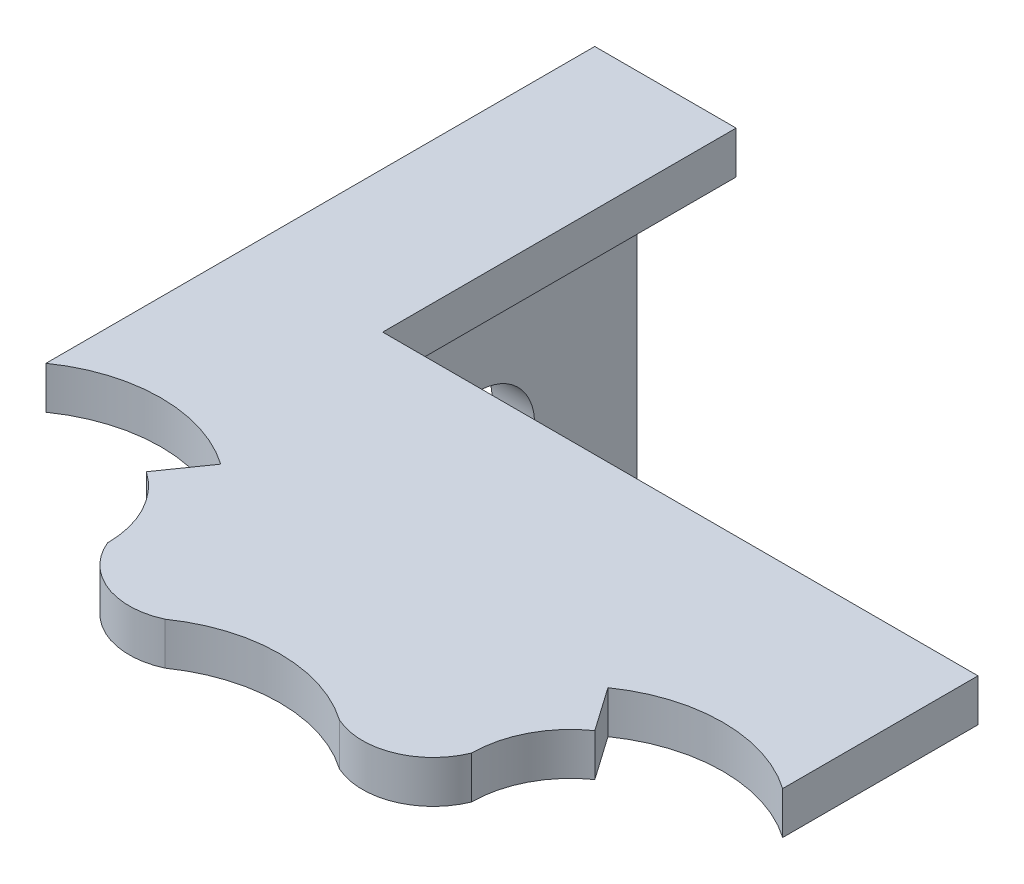
ISO-10303-21;
HEADER;
FILE_DESCRIPTION(('STEP AP214'),'2;1');
FILE_NAME('part.step','',(''),(''),'','','');
FILE_SCHEMA(('AUTOMOTIVE_DESIGN { 1 0 10303 214 1 1 1 1 }'));
ENDSEC;
DATA;
#1=APPLICATION_CONTEXT('core data for automotive mechanical design processes');
#2=APPLICATION_PROTOCOL_DEFINITION('international standard','automotive_design',2000,#1);
#3=PRODUCT_CONTEXT('',#1,'mechanical');
#4=PRODUCT('Part','Part','',(#3));
#5=PRODUCT_RELATED_PRODUCT_CATEGORY('part','',(#4));
#6=PRODUCT_DEFINITION_FORMATION('','',#4);
#7=PRODUCT_DEFINITION_CONTEXT('part definition',#1,'design');
#8=PRODUCT_DEFINITION('design','',#6,#7);
#9=PRODUCT_DEFINITION_SHAPE('','',#8);
#10=(LENGTH_UNIT() NAMED_UNIT(*) SI_UNIT(.MILLI.,.METRE.));
#11=(NAMED_UNIT(*) PLANE_ANGLE_UNIT() SI_UNIT($,.RADIAN.));
#12=(NAMED_UNIT(*) SI_UNIT($,.STERADIAN.) SOLID_ANGLE_UNIT());
#13=UNCERTAINTY_MEASURE_WITH_UNIT(LENGTH_MEASURE(1.E-05),#10,'distance_accuracy_value','');
#14=(GEOMETRIC_REPRESENTATION_CONTEXT(3) GLOBAL_UNCERTAINTY_ASSIGNED_CONTEXT((#13)) GLOBAL_UNIT_ASSIGNED_CONTEXT((#10,
#11,#12)) REPRESENTATION_CONTEXT('',''));
#15=CARTESIAN_POINT('',(0.,0.,0.));
#16=DIRECTION('',(0.,0.,1.));
#17=DIRECTION('',(1.,0.,0.));
#18=AXIS2_PLACEMENT_3D('',#15,#16,#17);
#19=CARTESIAN_POINT('',(-19.8752830168529,3.,-11.4749999999999));
#20=DIRECTION('',(0.,-1.,0.));
#21=DIRECTION('',(0.,0.,-1.));
#22=AXIS2_PLACEMENT_3D('',#19,#20,#21);
#23=CYLINDRICAL_SURFACE('',#22,10.775);
#24=CARTESIAN_POINT('',(-19.8752830168529,0.,-11.4749999999999));
#25=DIRECTION('',(0.,-1.,0.));
#26=DIRECTION('',(0.,0.,-1.));
#27=AXIS2_PLACEMENT_3D('',#24,#25,#26);
#28=CIRCLE('',#27,10.775);
#29=CARTESIAN_POINT('',(-26.0555691185354,0.,-20.3013632772138));
#30=VERTEX_POINT('',#29);
#31=CARTESIAN_POINT('',(-13.6949969151704,0.,-20.3013632772138));
#32=VERTEX_POINT('',#31);
#33=EDGE_CURVE('E180',#30,#32,#28,.T.);
#34=ORIENTED_EDGE('',*,*,#33,.T.);
#35=DIRECTION('',(0.,-1.,0.));
#36=VECTOR('',#35,1.);
#37=CARTESIAN_POINT('',(-13.6949969151704,3.,-20.3013632772138));
#38=LINE('',#37,#36);
#39=CARTESIAN_POINT('',(-13.6949969151704,3.,-20.3013632772138));
#40=VERTEX_POINT('',#39);
#41=EDGE_CURVE('E11',#40,#32,#38,.T.);
#42=ORIENTED_EDGE('',*,*,#41,.F.);
#43=CARTESIAN_POINT('',(-19.8752830168529,3.,-11.4749999999999));
#44=DIRECTION('',(0.,-1.,0.));
#45=DIRECTION('',(0.,0.,-1.));
#46=AXIS2_PLACEMENT_3D('',#43,#44,#45);
#47=CIRCLE('',#46,10.775);
#48=CARTESIAN_POINT('',(-26.0555691185354,3.,-20.3013632772138));
#49=VERTEX_POINT('',#48);
#50=EDGE_CURVE('E189',#49,#40,#47,.T.);
#51=ORIENTED_EDGE('',*,*,#50,.F.);
#52=DIRECTION('',(0.,-1.,0.));
#53=VECTOR('',#52,1.);
#54=CARTESIAN_POINT('',(-26.0555691185354,3.,-20.3013632772138));
#55=LINE('',#54,#53);
#56=EDGE_CURVE('E217',#49,#30,#55,.T.);
#57=ORIENTED_EDGE('',*,*,#56,.T.);
#58=EDGE_LOOP('',(#34,#42,#51,#57));
#59=FACE_BOUND('',#58,.T.);
#60=ADVANCED_FACE('F38',(#59),#23,.F.);
#61=CARTESIAN_POINT('',(-15.8602479623956,3.,-17.2090643100228));
#62=DIRECTION('',(0.819152044288993,0.,0.573576436351044));
#63=DIRECTION('',(0.573576436351044,0.,-0.819152044288993));
#64=AXIS2_PLACEMENT_3D('',#61,#62,#63);
#65=PLANE('',#64);
#66=DIRECTION('',(-0.573576436351044,0.,0.819152044288993));
#67=VECTOR('',#66,1.);
#68=CARTESIAN_POINT('',(-15.8602479623956,0.,-17.2090643100228));
#69=LINE('',#68,#67);
#70=CARTESIAN_POINT('',(-15.8602479623956,0.,-17.2090643100228));
#71=VERTEX_POINT('',#70);
#72=EDGE_CURVE('E183',#32,#71,#69,.T.);
#73=ORIENTED_EDGE('',*,*,#72,.T.);
#74=DIRECTION('',(0.,-1.,0.));
#75=VECTOR('',#74,1.);
#76=CARTESIAN_POINT('',(-15.8602479623956,3.,-17.2090643100228));
#77=LINE('',#76,#75);
#78=CARTESIAN_POINT('',(-15.8602479623956,3.,-17.2090643100228));
#79=VERTEX_POINT('',#78);
#80=EDGE_CURVE('E45',#79,#71,#77,.T.);
#81=ORIENTED_EDGE('',*,*,#80,.F.);
#82=DIRECTION('',(-0.573576436351044,0.,0.819152044288993));
#83=VECTOR('',#82,1.);
#84=CARTESIAN_POINT('',(-15.8602479623956,3.,-17.2090643100228));
#85=LINE('',#84,#83);
#86=EDGE_CURVE('E192',#40,#79,#85,.T.);
#87=ORIENTED_EDGE('',*,*,#86,.F.);
#88=ORIENTED_EDGE('',*,*,#41,.T.);
#89=EDGE_LOOP('',(#73,#81,#87,#88));
#90=FACE_BOUND('',#89,.T.);
#91=ADVANCED_FACE('F300',(#90),#65,.F.);
#92=CARTESIAN_POINT('',(-19.875283016853,3.,-11.4749999999998));
#93=DIRECTION('',(0.,-1.,0.));
#94=DIRECTION('',(0.,0.,-1.));
#95=AXIS2_PLACEMENT_3D('',#92,#93,#94);
#96=CYLINDRICAL_SURFACE('',#95,7.00000000000008);
#97=CARTESIAN_POINT('',(-19.875283016853,0.,-11.4749999999998));
#98=DIRECTION('',(0.,-1.,0.));
#99=DIRECTION('',(0.,0.,-1.));
#100=AXIS2_PLACEMENT_3D('',#97,#98,#99);
#101=CIRCLE('',#100,7.00000000000008);
#102=CARTESIAN_POINT('',(-12.8752830168529,0.,-11.4749999999999));
#103=VERTEX_POINT('',#102);
#104=EDGE_CURVE('E220',#71,#103,#101,.T.);
#105=ORIENTED_EDGE('',*,*,#104,.T.);
#106=DIRECTION('',(0.,-1.,0.));
#107=VECTOR('',#106,1.);
#108=CARTESIAN_POINT('',(-12.8752830168529,3.,-11.4749999999999));
#109=LINE('',#108,#107);
#110=CARTESIAN_POINT('',(-12.8752830168529,3.,-11.4749999999999));
#111=VERTEX_POINT('',#110);
#112=EDGE_CURVE('E272',#111,#103,#109,.T.);
#113=ORIENTED_EDGE('',*,*,#112,.F.);
#114=CARTESIAN_POINT('',(-19.875283016853,3.,-11.4749999999998));
#115=DIRECTION('',(0.,-1.,0.));
#116=DIRECTION('',(0.,0.,-1.));
#117=AXIS2_PLACEMENT_3D('',#114,#115,#116);
#118=CIRCLE('',#117,7.00000000000008);
#119=EDGE_CURVE('E194',#79,#111,#118,.T.);
#120=ORIENTED_EDGE('',*,*,#119,.F.);
#121=ORIENTED_EDGE('',*,*,#80,.T.);
#122=EDGE_LOOP('',(#105,#113,#120,#121));
#123=FACE_BOUND('',#122,.T.);
#124=ADVANCED_FACE('F279',(#123),#96,.F.);
#125=CARTESIAN_POINT('',(-8.25129203559566,3.,-13.3772900423571));
#126=DIRECTION('',(0.,-1.,0.));
#127=DIRECTION('',(0.,0.,-1.));
#128=AXIS2_PLACEMENT_3D('',#125,#126,#127);
#129=CYLINDRICAL_SURFACE('',#128,5.);
#130=CARTESIAN_POINT('',(-8.25129203559566,0.,-13.3772900423571));
#131=DIRECTION('',(0.,1.,0.));
#132=DIRECTION('',(0.,0.,1.));
#133=AXIS2_PLACEMENT_3D('',#130,#131,#132);
#134=CIRCLE('',#133,5.);
#135=CARTESIAN_POINT('',(-6.18028610168251,0.,-8.82636327721389));
#136=VERTEX_POINT('',#135);
#137=EDGE_CURVE('E222',#103,#136,#134,.T.);
#138=ORIENTED_EDGE('',*,*,#137,.T.);
#139=DIRECTION('',(0.,-1.,0.));
#140=VECTOR('',#139,1.);
#141=CARTESIAN_POINT('',(-6.18028610168251,3.,-8.82636327721389));
#142=LINE('',#141,#140);
#143=CARTESIAN_POINT('',(-6.18028610168251,3.,-8.82636327721389));
#144=VERTEX_POINT('',#143);
#145=EDGE_CURVE('E269',#144,#136,#142,.T.);
#146=ORIENTED_EDGE('',*,*,#145,.F.);
#147=CARTESIAN_POINT('',(-8.25129203559566,3.,-13.3772900423571));
#148=DIRECTION('',(0.,1.,0.));
#149=DIRECTION('',(0.,0.,1.));
#150=AXIS2_PLACEMENT_3D('',#147,#148,#149);
#151=CIRCLE('',#150,5.);
#152=EDGE_CURVE('E196',#111,#144,#151,.T.);
#153=ORIENTED_EDGE('',*,*,#152,.F.);
#154=ORIENTED_EDGE('',*,*,#112,.T.);
#155=EDGE_LOOP('',(#138,#146,#153,#154));
#156=FACE_BOUND('',#155,.T.);
#157=ADVANCED_FACE('F288',(#156),#129,.T.);
#158=CARTESIAN_POINT('',(0.,3.,0.));
#159=DIRECTION('',(0.,-1.,0.));
#160=DIRECTION('',(0.,0.,-1.));
#161=AXIS2_PLACEMENT_3D('',#158,#159,#160);
#162=CYLINDRICAL_SURFACE('',#161,10.775);
#163=CARTESIAN_POINT('',(0.,0.,0.));
#164=DIRECTION('',(0.,-1.,0.));
#165=DIRECTION('',(0.,0.,-1.));
#166=AXIS2_PLACEMENT_3D('',#163,#164,#165);
#167=CIRCLE('',#166,10.775);
#168=CARTESIAN_POINT('',(6.18028610168249,0.,-8.8263632772139));
#169=VERTEX_POINT('',#168);
#170=EDGE_CURVE('E224',#136,#169,#167,.T.);
#171=ORIENTED_EDGE('',*,*,#170,.T.);
#172=DIRECTION('',(0.,-1.,0.));
#173=VECTOR('',#172,1.);
#174=CARTESIAN_POINT('',(6.18028610168249,3.,-8.8263632772139));
#175=LINE('',#174,#173);
#176=CARTESIAN_POINT('',(6.18028610168249,3.,-8.8263632772139));
#177=VERTEX_POINT('',#176);
#178=EDGE_CURVE('E266',#177,#169,#175,.T.);
#179=ORIENTED_EDGE('',*,*,#178,.F.);
#180=CARTESIAN_POINT('',(0.,3.,0.));
#181=DIRECTION('',(0.,-1.,0.));
#182=DIRECTION('',(0.,0.,-1.));
#183=AXIS2_PLACEMENT_3D('',#180,#181,#182);
#184=CIRCLE('',#183,10.775);
#185=EDGE_CURVE('E198',#144,#177,#184,.T.);
#186=ORIENTED_EDGE('',*,*,#185,.F.);
#187=ORIENTED_EDGE('',*,*,#145,.T.);
#188=EDGE_LOOP('',(#171,#179,#186,#187));
#189=FACE_BOUND('',#188,.T.);
#190=ADVANCED_FACE('F292',(#189),#162,.F.);
#191=CARTESIAN_POINT('',(8.25129203559566,3.,-13.3772900423571));
#192=DIRECTION('',(0.,-1.,0.));
#193=DIRECTION('',(0.,0.,-1.));
#194=AXIS2_PLACEMENT_3D('',#191,#192,#193);
#195=CYLINDRICAL_SURFACE('',#194,5.00000000000001);
#196=CARTESIAN_POINT('',(8.25129203559566,0.,-13.3772900423571));
#197=DIRECTION('',(0.,1.,0.));
#198=DIRECTION('',(0.,0.,1.));
#199=AXIS2_PLACEMENT_3D('',#196,#197,#198);
#200=CIRCLE('',#199,5.00000000000001);
#201=CARTESIAN_POINT('',(12.8752830168529,0.,-11.4749999999998));
#202=VERTEX_POINT('',#201);
#203=EDGE_CURVE('E226',#169,#202,#200,.T.);
#204=ORIENTED_EDGE('',*,*,#203,.T.);
#205=DIRECTION('',(0.,-1.,0.));
#206=VECTOR('',#205,1.);
#207=CARTESIAN_POINT('',(12.8752830168529,3.,-11.4749999999998));
#208=LINE('',#207,#206);
#209=CARTESIAN_POINT('',(12.8752830168529,3.,-11.4749999999998));
#210=VERTEX_POINT('',#209);
#211=EDGE_CURVE('E263',#210,#202,#208,.T.);
#212=ORIENTED_EDGE('',*,*,#211,.F.);
#213=CARTESIAN_POINT('',(8.25129203559566,3.,-13.3772900423571));
#214=DIRECTION('',(0.,1.,0.));
#215=DIRECTION('',(0.,0.,1.));
#216=AXIS2_PLACEMENT_3D('',#213,#214,#215);
#217=CIRCLE('',#216,5.00000000000001);
#218=EDGE_CURVE('E200',#177,#210,#217,.T.);
#219=ORIENTED_EDGE('',*,*,#218,.F.);
#220=ORIENTED_EDGE('',*,*,#178,.T.);
#221=EDGE_LOOP('',(#204,#212,#219,#220));
#222=FACE_BOUND('',#221,.T.);
#223=ADVANCED_FACE('F348',(#222),#195,.T.);
#224=CARTESIAN_POINT('',(19.875283016853,3.,-11.4749999999998));
#225=DIRECTION('',(0.,-1.,0.));
#226=DIRECTION('',(0.,0.,-1.));
#227=AXIS2_PLACEMENT_3D('',#224,#225,#226);
#228=CYLINDRICAL_SURFACE('',#227,7.0000000000001);
#229=CARTESIAN_POINT('',(19.875283016853,0.,-11.4749999999998));
#230=DIRECTION('',(0.,-1.,0.));
#231=DIRECTION('',(0.,0.,-1.));
#232=AXIS2_PLACEMENT_3D('',#229,#230,#231);
#233=CIRCLE('',#232,7.0000000000001);
#234=CARTESIAN_POINT('',(15.8602479623956,0.,-17.2090643100228));
#235=VERTEX_POINT('',#234);
#236=EDGE_CURVE('E228',#202,#235,#233,.T.);
#237=ORIENTED_EDGE('',*,*,#236,.T.);
#238=DIRECTION('',(0.,-1.,0.));
#239=VECTOR('',#238,1.);
#240=CARTESIAN_POINT('',(15.8602479623956,3.,-17.2090643100228));
#241=LINE('',#240,#239);
#242=CARTESIAN_POINT('',(15.8602479623956,3.,-17.2090643100228));
#243=VERTEX_POINT('',#242);
#244=EDGE_CURVE('E260',#243,#235,#241,.T.);
#245=ORIENTED_EDGE('',*,*,#244,.F.);
#246=CARTESIAN_POINT('',(19.875283016853,3.,-11.4749999999998));
#247=DIRECTION('',(0.,-1.,0.));
#248=DIRECTION('',(0.,0.,-1.));
#249=AXIS2_PLACEMENT_3D('',#246,#247,#248);
#250=CIRCLE('',#249,7.0000000000001);
#251=EDGE_CURVE('E202',#210,#243,#250,.T.);
#252=ORIENTED_EDGE('',*,*,#251,.F.);
#253=ORIENTED_EDGE('',*,*,#211,.T.);
#254=EDGE_LOOP('',(#237,#245,#252,#253));
#255=FACE_BOUND('',#254,.T.);
#256=ADVANCED_FACE('F351',(#255),#228,.F.);
#257=CARTESIAN_POINT('',(15.8602479623956,3.,-17.2090643100228));
#258=DIRECTION('',(-0.819152044288992,0.,0.573576436351045));
#259=DIRECTION('',(0.573576436351045,0.,0.819152044288992));
#260=AXIS2_PLACEMENT_3D('',#257,#258,#259);
#261=PLANE('',#260);
#262=DIRECTION('',(-0.573576436351045,0.,-0.819152044288992));
#263=VECTOR('',#262,1.);
#264=CARTESIAN_POINT('',(15.8602479623956,0.,-17.2090643100228));
#265=LINE('',#264,#263);
#266=CARTESIAN_POINT('',(13.6949969151704,0.,-20.3013632772138));
#267=VERTEX_POINT('',#266);
#268=EDGE_CURVE('E230',#235,#267,#265,.T.);
#269=ORIENTED_EDGE('',*,*,#268,.T.);
#270=DIRECTION('',(0.,-1.,0.));
#271=VECTOR('',#270,1.);
#272=CARTESIAN_POINT('',(13.6949969151704,3.,-20.3013632772138));
#273=LINE('',#272,#271);
#274=CARTESIAN_POINT('',(13.6949969151704,3.,-20.3013632772138));
#275=VERTEX_POINT('',#274);
#276=EDGE_CURVE('E257',#275,#267,#273,.T.);
#277=ORIENTED_EDGE('',*,*,#276,.F.);
#278=DIRECTION('',(-0.573576436351045,0.,-0.819152044288992));
#279=VECTOR('',#278,1.);
#280=CARTESIAN_POINT('',(15.8602479623956,3.,-17.2090643100228));
#281=LINE('',#280,#279);
#282=EDGE_CURVE('E204',#243,#275,#281,.T.);
#283=ORIENTED_EDGE('',*,*,#282,.F.);
#284=ORIENTED_EDGE('',*,*,#244,.T.);
#285=EDGE_LOOP('',(#269,#277,#283,#284));
#286=FACE_BOUND('',#285,.T.);
#287=ADVANCED_FACE('F355',(#286),#261,.F.);
#288=CARTESIAN_POINT('',(19.8752830168529,3.,-11.4749999999998));
#289=DIRECTION('',(0.,-1.,0.));
#290=DIRECTION('',(0.,0.,-1.));
#291=AXIS2_PLACEMENT_3D('',#288,#289,#290);
#292=CYLINDRICAL_SURFACE('',#291,10.775);
#293=CARTESIAN_POINT('',(19.8752830168529,0.,-11.4749999999998));
#294=DIRECTION('',(0.,-1.,0.));
#295=DIRECTION('',(0.,0.,-1.));
#296=AXIS2_PLACEMENT_3D('',#293,#294,#295);
#297=CIRCLE('',#296,10.775);
#298=CARTESIAN_POINT('',(26.0555691185354,0.,-20.3013632772138));
#299=VERTEX_POINT('',#298);
#300=EDGE_CURVE('E232',#267,#299,#297,.T.);
#301=ORIENTED_EDGE('',*,*,#300,.T.);
#302=DIRECTION('',(0.,-1.,0.));
#303=VECTOR('',#302,1.);
#304=CARTESIAN_POINT('',(26.0555691185354,3.,-20.3013632772138));
#305=LINE('',#304,#303);
#306=CARTESIAN_POINT('',(26.0555691185354,3.,-20.3013632772138));
#307=VERTEX_POINT('',#306);
#308=EDGE_CURVE('E254',#307,#299,#305,.T.);
#309=ORIENTED_EDGE('',*,*,#308,.F.);
#310=CARTESIAN_POINT('',(19.8752830168529,3.,-11.4749999999998));
#311=DIRECTION('',(0.,-1.,0.));
#312=DIRECTION('',(0.,0.,-1.));
#313=AXIS2_PLACEMENT_3D('',#310,#311,#312);
#314=CIRCLE('',#313,10.775);
#315=EDGE_CURVE('E206',#275,#307,#314,.T.);
#316=ORIENTED_EDGE('',*,*,#315,.F.);
#317=ORIENTED_EDGE('',*,*,#276,.T.);
#318=EDGE_LOOP('',(#301,#309,#316,#317));
#319=FACE_BOUND('',#318,.T.);
#320=ADVANCED_FACE('F359',(#319),#292,.F.);
#321=CARTESIAN_POINT('',(26.0555691185354,3.,-34.1183632772138));
#322=DIRECTION('',(-1.,0.,0.));
#323=DIRECTION('',(0.,0.,1.));
#324=AXIS2_PLACEMENT_3D('',#321,#322,#323);
#325=PLANE('',#324);
#326=DIRECTION('',(0.,0.,-1.));
#327=VECTOR('',#326,1.);
#328=CARTESIAN_POINT('',(26.0555691185354,0.,-34.1183632772138));
#329=LINE('',#328,#327);
#330=CARTESIAN_POINT('',(26.0555691185354,0.,-34.1183632772138));
#331=VERTEX_POINT('',#330);
#332=EDGE_CURVE('E234',#299,#331,#329,.T.);
#333=ORIENTED_EDGE('',*,*,#332,.T.);
#334=DIRECTION('',(0.,-1.,0.));
#335=VECTOR('',#334,1.);
#336=CARTESIAN_POINT('',(26.0555691185354,3.,-34.1183632772138));
#337=LINE('',#336,#335);
#338=CARTESIAN_POINT('',(26.0555691185354,3.,-34.1183632772138));
#339=VERTEX_POINT('',#338);
#340=EDGE_CURVE('E251',#339,#331,#337,.T.);
#341=ORIENTED_EDGE('',*,*,#340,.F.);
#342=DIRECTION('',(0.,0.,-1.));
#343=VECTOR('',#342,1.);
#344=CARTESIAN_POINT('',(26.0555691185354,3.,-34.1183632772138));
#345=LINE('',#344,#343);
#346=EDGE_CURVE('E208',#307,#339,#345,.T.);
#347=ORIENTED_EDGE('',*,*,#346,.F.);
#348=ORIENTED_EDGE('',*,*,#308,.T.);
#349=EDGE_LOOP('',(#333,#341,#347,#348));
#350=FACE_BOUND('',#349,.T.);
#351=ADVANCED_FACE('F363',(#350),#325,.F.);
#352=CARTESIAN_POINT('',(-16.0555691185354,3.,-34.1183632772138));
#353=DIRECTION('',(0.,0.,1.));
#354=DIRECTION('',(1.,0.,0.));
#355=AXIS2_PLACEMENT_3D('',#352,#353,#354);
#356=PLANE('',#355);
#357=DIRECTION('',(-1.,0.,0.));
#358=VECTOR('',#357,1.);
#359=CARTESIAN_POINT('',(-16.0555691185354,0.,-34.1183632772138));
#360=LINE('',#359,#358);
#361=CARTESIAN_POINT('',(-16.0555691185354,0.,-34.1183632772138));
#362=VERTEX_POINT('',#361);
#363=EDGE_CURVE('E236',#331,#362,#360,.T.);
#364=ORIENTED_EDGE('',*,*,#363,.T.);
#365=DIRECTION('',(0.,-1.,0.));
#366=VECTOR('',#365,1.);
#367=CARTESIAN_POINT('',(-16.0555691185354,3.,-34.1183632772138));
#368=LINE('',#367,#366);
#369=CARTESIAN_POINT('',(-16.0555691185354,3.,-34.1183632772138));
#370=VERTEX_POINT('',#369);
#371=EDGE_CURVE('E248',#370,#362,#368,.T.);
#372=ORIENTED_EDGE('',*,*,#371,.F.);
#373=DIRECTION('',(-1.,0.,0.));
#374=VECTOR('',#373,1.);
#375=CARTESIAN_POINT('',(-16.0555691185354,3.,-34.1183632772138));
#376=LINE('',#375,#374);
#377=EDGE_CURVE('E210',#339,#370,#376,.T.);
#378=ORIENTED_EDGE('',*,*,#377,.F.);
#379=ORIENTED_EDGE('',*,*,#340,.T.);
#380=EDGE_LOOP('',(#364,#372,#378,#379));
#381=FACE_BOUND('',#380,.T.);
#382=ADVANCED_FACE('F367',(#381),#356,.F.);
#383=CARTESIAN_POINT('',(-16.0555691185354,3.,-59.1183632772138));
#384=DIRECTION('',(-1.,0.,0.));
#385=DIRECTION('',(0.,0.,1.));
#386=AXIS2_PLACEMENT_3D('',#383,#384,#385);
#387=PLANE('',#386);
#388=DIRECTION('',(0.,0.,-1.));
#389=VECTOR('',#388,1.);
#390=CARTESIAN_POINT('',(-16.0555691185354,0.,-59.1183632772138));
#391=LINE('',#390,#389);
#392=CARTESIAN_POINT('',(-16.0555691185354,0.,-59.1183632772138));
#393=VERTEX_POINT('',#392);
#394=EDGE_CURVE('E238',#362,#393,#391,.T.);
#395=ORIENTED_EDGE('',*,*,#394,.T.);
#396=DIRECTION('',(0.,-1.,0.));
#397=VECTOR('',#396,1.);
#398=CARTESIAN_POINT('',(-16.0555691185354,3.,-59.1183632772138));
#399=LINE('',#398,#397);
#400=CARTESIAN_POINT('',(-16.0555691185354,3.,-59.1183632772138));
#401=VERTEX_POINT('',#400);
#402=EDGE_CURVE('E246',#401,#393,#399,.T.);
#403=ORIENTED_EDGE('',*,*,#402,.F.);
#404=DIRECTION('',(0.,0.,-1.));
#405=VECTOR('',#404,1.);
#406=CARTESIAN_POINT('',(-16.0555691185354,3.,-59.1183632772138));
#407=LINE('',#406,#405);
#408=EDGE_CURVE('E212',#370,#401,#407,.T.);
#409=ORIENTED_EDGE('',*,*,#408,.F.);
#410=ORIENTED_EDGE('',*,*,#371,.T.);
#411=EDGE_LOOP('',(#395,#403,#409,#410));
#412=FACE_BOUND('',#411,.T.);
#413=ADVANCED_FACE('F332',(#412),#387,.F.);
#414=CARTESIAN_POINT('',(-26.0555691185354,3.,-59.1183632772138));
#415=DIRECTION('',(0.,0.,1.));
#416=DIRECTION('',(1.,0.,0.));
#417=AXIS2_PLACEMENT_3D('',#414,#415,#416);
#418=PLANE('',#417);
#419=DIRECTION('',(-1.,0.,0.));
#420=VECTOR('',#419,1.);
#421=CARTESIAN_POINT('',(-26.0555691185354,0.,-59.1183632772138));
#422=LINE('',#421,#420);
#423=CARTESIAN_POINT('',(-23.0555691185354,0.,-59.1183632772138));
#424=VERTEX_POINT('',#423);
#425=EDGE_CURVE('E179',#393,#424,#422,.T.);
#426=ORIENTED_EDGE('',*,*,#425,.T.);
#427=DIRECTION('',(0.,1.,0.));
#428=VECTOR('',#427,1.);
#429=CARTESIAN_POINT('',(-23.0555691185354,-25.,-59.1183632772138));
#430=LINE('',#429,#428);
#431=CARTESIAN_POINT('',(-23.0555691185354,-25.,-59.1183632772138));
#432=VERTEX_POINT('',#431);
#433=EDGE_CURVE('E160',#432,#424,#430,.T.);
#434=ORIENTED_EDGE('',*,*,#433,.F.);
#435=DIRECTION('',(1.,0.,0.));
#436=VECTOR('',#435,1.);
#437=CARTESIAN_POINT('',(-26.0555691185354,-25.,-59.1183632772138));
#438=LINE('',#437,#436);
#439=CARTESIAN_POINT('',(-26.0555691185354,-25.,-59.1183632772138));
#440=VERTEX_POINT('',#439);
#441=EDGE_CURVE('E166',#440,#432,#438,.T.);
#442=ORIENTED_EDGE('',*,*,#441,.F.);
#443=DIRECTION('',(0.,-1.,0.));
#444=VECTOR('',#443,1.);
#445=CARTESIAN_POINT('',(-26.0555691185354,3.,-59.1183632772138));
#446=LINE('',#445,#444);
#447=CARTESIAN_POINT('',(-26.0555691185354,3.,-59.1183632772138));
#448=VERTEX_POINT('',#447);
#449=EDGE_CURVE('E244',#448,#440,#446,.T.);
#450=ORIENTED_EDGE('',*,*,#449,.F.);
#451=DIRECTION('',(-1.,0.,0.));
#452=VECTOR('',#451,1.);
#453=CARTESIAN_POINT('',(-26.0555691185354,3.,-59.1183632772138));
#454=LINE('',#453,#452);
#455=EDGE_CURVE('E214',#401,#448,#454,.T.);
#456=ORIENTED_EDGE('',*,*,#455,.F.);
#457=ORIENTED_EDGE('',*,*,#402,.T.);
#458=EDGE_LOOP('',(#426,#434,#442,#450,#456,#457));
#459=FACE_BOUND('',#458,.T.);
#460=ADVANCED_FACE('F177',(#459),#418,.F.);
#461=CARTESIAN_POINT('',(-26.0555691185354,3.,-20.3013632772138));
#462=DIRECTION('',(1.,0.,0.));
#463=DIRECTION('',(0.,0.,-1.));
#464=AXIS2_PLACEMENT_3D('',#461,#462,#463);
#465=PLANE('',#464);
#466=CARTESIAN_POINT('',(-26.0555691185354,-15.,-47.8683632772138));
#467=DIRECTION('',(-1.,0.,0.));
#468=DIRECTION('',(0.,0.,1.));
#469=AXIS2_PLACEMENT_3D('',#466,#467,#468);
#470=CIRCLE('',#469,4.);
#471=CARTESIAN_POINT('',(-26.0555691185354,-15.,-43.8683632772138));
#472=VERTEX_POINT('',#471);
#473=EDGE_CURVE('E317',#472,#472,#470,.T.);
#474=ORIENTED_EDGE('',*,*,#473,.F.);
#475=EDGE_LOOP('',(#474));
#476=FACE_BOUND('',#475,.T.);
#477=ORIENTED_EDGE('',*,*,#449,.T.);
#478=DIRECTION('',(0.,0.,-1.));
#479=VECTOR('',#478,1.);
#480=CARTESIAN_POINT('',(-26.0555691185354,-25.,-59.1183632772138));
#481=LINE('',#480,#479);
#482=CARTESIAN_POINT('',(-26.0555691185354,-25.,-36.6183632772138));
#483=VERTEX_POINT('',#482);
#484=EDGE_CURVE('E172',#483,#440,#481,.T.);
#485=ORIENTED_EDGE('',*,*,#484,.F.);
#486=DIRECTION('',(0.,1.,0.));
#487=VECTOR('',#486,1.);
#488=CARTESIAN_POINT('',(-26.0555691185354,-25.,-36.6183632772138));
#489=LINE('',#488,#487);
#490=CARTESIAN_POINT('',(-26.0555691185354,0.,-36.6183632772138));
#491=VERTEX_POINT('',#490);
#492=EDGE_CURVE('E185',#483,#491,#489,.T.);
#493=ORIENTED_EDGE('',*,*,#492,.T.);
#494=DIRECTION('',(0.,0.,1.));
#495=VECTOR('',#494,1.);
#496=CARTESIAN_POINT('',(-26.0555691185354,0.,-20.3013632772138));
#497=LINE('',#496,#495);
#498=EDGE_CURVE('E58',#491,#30,#497,.T.);
#499=ORIENTED_EDGE('',*,*,#498,.T.);
#500=ORIENTED_EDGE('',*,*,#56,.F.);
#501=DIRECTION('',(0.,0.,1.));
#502=VECTOR('',#501,1.);
#503=CARTESIAN_POINT('',(-26.0555691185354,3.,-59.1183632772138));
#504=LINE('',#503,#502);
#505=EDGE_CURVE('E216',#448,#49,#504,.T.);
#506=ORIENTED_EDGE('',*,*,#505,.F.);
#507=EDGE_LOOP('',(#477,#485,#493,#499,#500,#506));
#508=FACE_BOUND('',#507,.T.);
#509=ADVANCED_FACE('F305',(#476,#508),#465,.F.);
#510=CARTESIAN_POINT('',(-19.8752830168529,3.,-11.4749999999999));
#511=DIRECTION('',(0.,-1.,0.));
#512=DIRECTION('',(0.,0.,-1.));
#513=AXIS2_PLACEMENT_3D('',#510,#511,#512);
#514=PLANE('',#513);
#515=ORIENTED_EDGE('',*,*,#50,.T.);
#516=ORIENTED_EDGE('',*,*,#86,.T.);
#517=ORIENTED_EDGE('',*,*,#119,.T.);
#518=ORIENTED_EDGE('',*,*,#152,.T.);
#519=ORIENTED_EDGE('',*,*,#185,.T.);
#520=ORIENTED_EDGE('',*,*,#218,.T.);
#521=ORIENTED_EDGE('',*,*,#251,.T.);
#522=ORIENTED_EDGE('',*,*,#282,.T.);
#523=ORIENTED_EDGE('',*,*,#315,.T.);
#524=ORIENTED_EDGE('',*,*,#346,.T.);
#525=ORIENTED_EDGE('',*,*,#377,.T.);
#526=ORIENTED_EDGE('',*,*,#408,.T.);
#527=ORIENTED_EDGE('',*,*,#455,.T.);
#528=ORIENTED_EDGE('',*,*,#505,.T.);
#529=EDGE_LOOP('',(#515,#516,#517,#518,#519,#520,#521,#522,#523,#524,#525,#526,#527,#528));
#530=FACE_BOUND('',#529,.T.);
#531=ADVANCED_FACE('F296',(#530),#514,.F.);
#532=CARTESIAN_POINT('',(-19.8752830168529,0.,-11.4749999999999));
#533=DIRECTION('',(0.,-1.,0.));
#534=DIRECTION('',(0.,0.,-1.));
#535=AXIS2_PLACEMENT_3D('',#532,#533,#534);
#536=PLANE('',#535);
#537=DIRECTION('',(-1.,0.,0.));
#538=VECTOR('',#537,1.);
#539=CARTESIAN_POINT('',(-26.0555691185354,0.,-36.6183632772138));
#540=LINE('',#539,#538);
#541=CARTESIAN_POINT('',(-23.0555691185354,0.,-36.6183632772138));
#542=VERTEX_POINT('',#541);
#543=EDGE_CURVE('E175',#542,#491,#540,.T.);
#544=ORIENTED_EDGE('',*,*,#543,.F.);
#545=DIRECTION('',(0.,0.,1.));
#546=VECTOR('',#545,1.);
#547=CARTESIAN_POINT('',(-23.0555691185354,0.,-59.1183632772138));
#548=LINE('',#547,#546);
#549=EDGE_CURVE('E52',#424,#542,#548,.T.);
#550=ORIENTED_EDGE('',*,*,#549,.F.);
#551=ORIENTED_EDGE('',*,*,#425,.F.);
#552=ORIENTED_EDGE('',*,*,#394,.F.);
#553=ORIENTED_EDGE('',*,*,#363,.F.);
#554=ORIENTED_EDGE('',*,*,#332,.F.);
#555=ORIENTED_EDGE('',*,*,#300,.F.);
#556=ORIENTED_EDGE('',*,*,#268,.F.);
#557=ORIENTED_EDGE('',*,*,#236,.F.);
#558=ORIENTED_EDGE('',*,*,#203,.F.);
#559=ORIENTED_EDGE('',*,*,#170,.F.);
#560=ORIENTED_EDGE('',*,*,#137,.F.);
#561=ORIENTED_EDGE('',*,*,#104,.F.);
#562=ORIENTED_EDGE('',*,*,#72,.F.);
#563=ORIENTED_EDGE('',*,*,#33,.F.);
#564=ORIENTED_EDGE('',*,*,#498,.F.);
#565=EDGE_LOOP('',(#544,#550,#551,#552,#553,#554,#555,#556,#557,#558,#559,#560,#561,#562,#563,#564));
#566=FACE_BOUND('',#565,.T.);
#567=ADVANCED_FACE('F283',(#566),#536,.T.);
#568=CARTESIAN_POINT('',(-23.0555691185354,-25.,-59.1183632772138));
#569=DIRECTION('',(-1.,0.,0.));
#570=DIRECTION('',(0.,0.,1.));
#571=AXIS2_PLACEMENT_3D('',#568,#569,#570);
#572=PLANE('',#571);
#573=CARTESIAN_POINT('',(-23.0555691185354,-15.,-47.8683632772138));
#574=DIRECTION('',(-1.,0.,0.));
#575=DIRECTION('',(0.,0.,1.));
#576=AXIS2_PLACEMENT_3D('',#573,#574,#575);
#577=CIRCLE('',#576,4.);
#578=CARTESIAN_POINT('',(-23.0555691185354,-15.,-43.8683632772138));
#579=VERTEX_POINT('',#578);
#580=EDGE_CURVE('E312',#579,#579,#577,.F.);
#581=ORIENTED_EDGE('',*,*,#580,.F.);
#582=EDGE_LOOP('',(#581));
#583=FACE_BOUND('',#582,.T.);
#584=ORIENTED_EDGE('',*,*,#549,.T.);
#585=DIRECTION('',(0.,1.,0.));
#586=VECTOR('',#585,1.);
#587=CARTESIAN_POINT('',(-23.0555691185354,-25.,-36.6183632772138));
#588=LINE('',#587,#586);
#589=CARTESIAN_POINT('',(-23.0555691185354,-25.,-36.6183632772138));
#590=VERTEX_POINT('',#589);
#591=EDGE_CURVE('E162',#590,#542,#588,.T.);
#592=ORIENTED_EDGE('',*,*,#591,.F.);
#593=DIRECTION('',(0.,0.,1.));
#594=VECTOR('',#593,1.);
#595=CARTESIAN_POINT('',(-23.0555691185354,-25.,-59.1183632772138));
#596=LINE('',#595,#594);
#597=EDGE_CURVE('E156',#432,#590,#596,.T.);
#598=ORIENTED_EDGE('',*,*,#597,.F.);
#599=ORIENTED_EDGE('',*,*,#433,.T.);
#600=EDGE_LOOP('',(#584,#592,#598,#599));
#601=FACE_BOUND('',#600,.T.);
#602=ADVANCED_FACE('F158',(#583,#601),#572,.F.);
#603=CARTESIAN_POINT('',(-26.0555691185354,-25.,-36.6183632772138));
#604=DIRECTION('',(0.,0.,-1.));
#605=DIRECTION('',(-1.,0.,0.));
#606=AXIS2_PLACEMENT_3D('',#603,#604,#605);
#607=PLANE('',#606);
#608=ORIENTED_EDGE('',*,*,#543,.T.);
#609=ORIENTED_EDGE('',*,*,#492,.F.);
#610=DIRECTION('',(-1.,0.,0.));
#611=VECTOR('',#610,1.);
#612=CARTESIAN_POINT('',(-26.0555691185354,-25.,-36.6183632772138));
#613=LINE('',#612,#611);
#614=EDGE_CURVE('E165',#590,#483,#613,.T.);
#615=ORIENTED_EDGE('',*,*,#614,.F.);
#616=ORIENTED_EDGE('',*,*,#591,.T.);
#617=EDGE_LOOP('',(#608,#609,#615,#616));
#618=FACE_BOUND('',#617,.T.);
#619=ADVANCED_FACE('F418',(#618),#607,.F.);
#620=CARTESIAN_POINT('',(0.,-25.,0.));
#621=DIRECTION('',(0.,-1.,0.));
#622=DIRECTION('',(0.,0.,-1.));
#623=AXIS2_PLACEMENT_3D('',#620,#621,#622);
#624=PLANE('',#623);
#625=ORIENTED_EDGE('',*,*,#441,.T.);
#626=ORIENTED_EDGE('',*,*,#597,.T.);
#627=ORIENTED_EDGE('',*,*,#614,.T.);
#628=ORIENTED_EDGE('',*,*,#484,.T.);
#629=EDGE_LOOP('',(#625,#626,#627,#628));
#630=FACE_BOUND('',#629,.T.);
#631=ADVANCED_FACE('F170',(#630),#624,.T.);
#632=CARTESIAN_POINT('',(-11.7418606195507,-15.,-47.8683632772138));
#633=DIRECTION('',(-1.,0.,0.));
#634=DIRECTION('',(0.,0.,1.));
#635=AXIS2_PLACEMENT_3D('',#632,#633,#634);
#636=CYLINDRICAL_SURFACE('',#635,4.);
#637=CARTESIAN_POINT('',(-23.0555691185354,-15.,-43.8683632772138));
#638=CARTESIAN_POINT('',(-23.0868191185354,-15.,-43.8683632772138));
#639=CARTESIAN_POINT('',(-23.1180691185354,-15.,-43.8683632772138));
#640=CARTESIAN_POINT('',(-23.1805691185354,-15.,-43.8683632772138));
#641=CARTESIAN_POINT('',(-23.2118191185354,-15.,-43.8683632772138));
#642=CARTESIAN_POINT('',(-23.2743191185354,-15.,-43.8683632772138));
#643=CARTESIAN_POINT('',(-23.3055691185354,-15.,-43.8683632772138));
#644=CARTESIAN_POINT('',(-23.3680691185354,-15.,-43.8683632772138));
#645=CARTESIAN_POINT('',(-23.3993191185354,-15.,-43.8683632772138));
#646=CARTESIAN_POINT('',(-23.4618191185354,-15.,-43.8683632772138));
#647=CARTESIAN_POINT('',(-23.4930691185354,-15.,-43.8683632772138));
#648=CARTESIAN_POINT('',(-23.5555691185354,-15.,-43.8683632772138));
#649=CARTESIAN_POINT('',(-23.5868191185354,-15.,-43.8683632772138));
#650=CARTESIAN_POINT('',(-23.6493191185354,-15.,-43.8683632772138));
#651=CARTESIAN_POINT('',(-23.6805691185354,-15.,-43.8683632772138));
#652=CARTESIAN_POINT('',(-23.7430691185354,-15.,-43.8683632772138));
#653=CARTESIAN_POINT('',(-23.7743191185354,-15.,-43.8683632772138));
#654=CARTESIAN_POINT('',(-23.8368191185354,-15.,-43.8683632772138));
#655=CARTESIAN_POINT('',(-23.8680691185354,-15.,-43.8683632772138));
#656=CARTESIAN_POINT('',(-23.9305691185354,-15.,-43.8683632772138));
#657=CARTESIAN_POINT('',(-23.9618191185354,-15.,-43.8683632772138));
#658=CARTESIAN_POINT('',(-24.0243191185354,-15.,-43.8683632772138));
#659=CARTESIAN_POINT('',(-24.0555691185354,-15.,-43.8683632772138));
#660=CARTESIAN_POINT('',(-24.1180691185354,-15.,-43.8683632772138));
#661=CARTESIAN_POINT('',(-24.1493191185354,-15.,-43.8683632772138));
#662=CARTESIAN_POINT('',(-24.2118191185354,-15.,-43.8683632772138));
#663=CARTESIAN_POINT('',(-24.2430691185354,-15.,-43.8683632772138));
#664=CARTESIAN_POINT('',(-24.3055691185354,-15.,-43.8683632772138));
#665=CARTESIAN_POINT('',(-24.3368191185354,-15.,-43.8683632772138));
#666=CARTESIAN_POINT('',(-24.3993191185354,-15.,-43.8683632772138));
#667=CARTESIAN_POINT('',(-24.4305691185354,-15.,-43.8683632772138));
#668=CARTESIAN_POINT('',(-24.4930691185354,-15.,-43.8683632772138));
#669=CARTESIAN_POINT('',(-24.5243191185354,-15.,-43.8683632772138));
#670=CARTESIAN_POINT('',(-24.5868191185354,-15.,-43.8683632772138));
#671=CARTESIAN_POINT('',(-24.6180691185354,-15.,-43.8683632772138));
#672=CARTESIAN_POINT('',(-24.6805691185354,-15.,-43.8683632772138));
#673=CARTESIAN_POINT('',(-24.7118191185354,-15.,-43.8683632772138));
#674=CARTESIAN_POINT('',(-24.7743191185354,-15.,-43.8683632772138));
#675=CARTESIAN_POINT('',(-24.8055691185354,-15.,-43.8683632772138));
#676=CARTESIAN_POINT('',(-24.8680691185354,-15.,-43.8683632772138));
#677=CARTESIAN_POINT('',(-24.8993191185354,-15.,-43.8683632772138));
#678=CARTESIAN_POINT('',(-24.9618191185354,-15.,-43.8683632772138));
#679=CARTESIAN_POINT('',(-24.9930691185354,-15.,-43.8683632772138));
#680=CARTESIAN_POINT('',(-25.0555691185354,-15.,-43.8683632772138));
#681=CARTESIAN_POINT('',(-25.0868191185354,-15.,-43.8683632772138));
#682=CARTESIAN_POINT('',(-25.1493191185354,-15.,-43.8683632772138));
#683=CARTESIAN_POINT('',(-25.1805691185354,-15.,-43.8683632772138));
#684=CARTESIAN_POINT('',(-25.2430691185354,-15.,-43.8683632772138));
#685=CARTESIAN_POINT('',(-25.2743191185354,-15.,-43.8683632772138));
#686=CARTESIAN_POINT('',(-25.3368191185354,-15.,-43.8683632772138));
#687=CARTESIAN_POINT('',(-25.3680691185354,-15.,-43.8683632772138));
#688=CARTESIAN_POINT('',(-25.4305691185354,-15.,-43.8683632772138));
#689=CARTESIAN_POINT('',(-25.4618191185354,-15.,-43.8683632772138));
#690=CARTESIAN_POINT('',(-25.5243191185354,-15.,-43.8683632772138));
#691=CARTESIAN_POINT('',(-25.5555691185354,-15.,-43.8683632772138));
#692=CARTESIAN_POINT('',(-25.6180691185354,-15.,-43.8683632772138));
#693=CARTESIAN_POINT('',(-25.6493191185354,-15.,-43.8683632772138));
#694=CARTESIAN_POINT('',(-25.7118191185354,-15.,-43.8683632772138));
#695=CARTESIAN_POINT('',(-25.7430691185354,-15.,-43.8683632772138));
#696=CARTESIAN_POINT('',(-25.8055691185354,-15.,-43.8683632772138));
#697=CARTESIAN_POINT('',(-25.8368191185354,-15.,-43.8683632772138));
#698=CARTESIAN_POINT('',(-25.8993191185354,-15.,-43.8683632772138));
#699=CARTESIAN_POINT('',(-25.9305691185354,-15.,-43.8683632772138));
#700=CARTESIAN_POINT('',(-25.9930691185354,-15.,-43.8683632772138));
#701=CARTESIAN_POINT('',(-26.0243191185354,-15.,-43.8683632772138));
#702=CARTESIAN_POINT('',(-26.0555691185354,-15.,-43.8683632772138));
#703=B_SPLINE_CURVE_WITH_KNOTS('',3,(#637,#638,#639,#640,#641,#642,#643,#644,#645,#646,#647,
#648,#649,#650,#651,#652,#653,#654,#655,#656,#657,#658,#659,#660,#661,#662,#663,#664,#665,#666,
#667,#668,#669,#670,#671,#672,#673,#674,#675,#676,#677,#678,#679,#680,#681,#682,#683,#684,#685,
#686,#687,#688,#689,#690,#691,#692,#693,#694,#695,#696,#697,#698,#699,#700,#701,#702),
.UNSPECIFIED.,.F.,.F.,(4,2,2,2,2,2,2,2,2,2,2,2,2,2,2,2,2,2,2,2,2,2,2,2,2,2,2,2,2,2,2,2,4),(0.,
0.0937499999999966,0.1875,0.281249999999997,0.375,0.468749999999997,0.5625,0.656249999999997,
0.750000000000001,0.843749999999997,0.937500000000001,1.03125,1.125,1.21875,1.3125,1.40625,1.5,
1.59375,1.6875,1.78125,1.875,1.96875,2.0625,2.15625,2.25,2.34375,2.4375,2.53125,2.625,2.71875,
2.8125,2.90625,3.),.UNSPECIFIED.);
#704=EDGE_CURVE('BSEAM321',#579,#472,#703,.T.);
#705=ORIENTED_EDGE('',*,*,#580,.T.);
#706=ORIENTED_EDGE('',*,*,#473,.T.);
#707=ORIENTED_EDGE('',*,*,#704,.T.);
#708=ORIENTED_EDGE('',*,*,#704,.F.);
#709=EDGE_LOOP('',(#705,#707,#706,#708));
#710=FACE_BOUND('',#709,.T.);
#711=ADVANCED_FACE('F321',(#710),#636,.F.);
#712=CLOSED_SHELL('',(#60,#91,#124,#157,#190,#223,#256,#287,#320,#351,#382,#413,#460,#509,#531,
#567,#602,#619,#631,#711));
#713=MANIFOLD_SOLID_BREP('B2',#712);
#714=ADVANCED_BREP_SHAPE_REPRESENTATION('',(#18,#713),#14);
#715=SHAPE_DEFINITION_REPRESENTATION(#9,#714);
ENDSEC;
END-ISO-10303-21;
